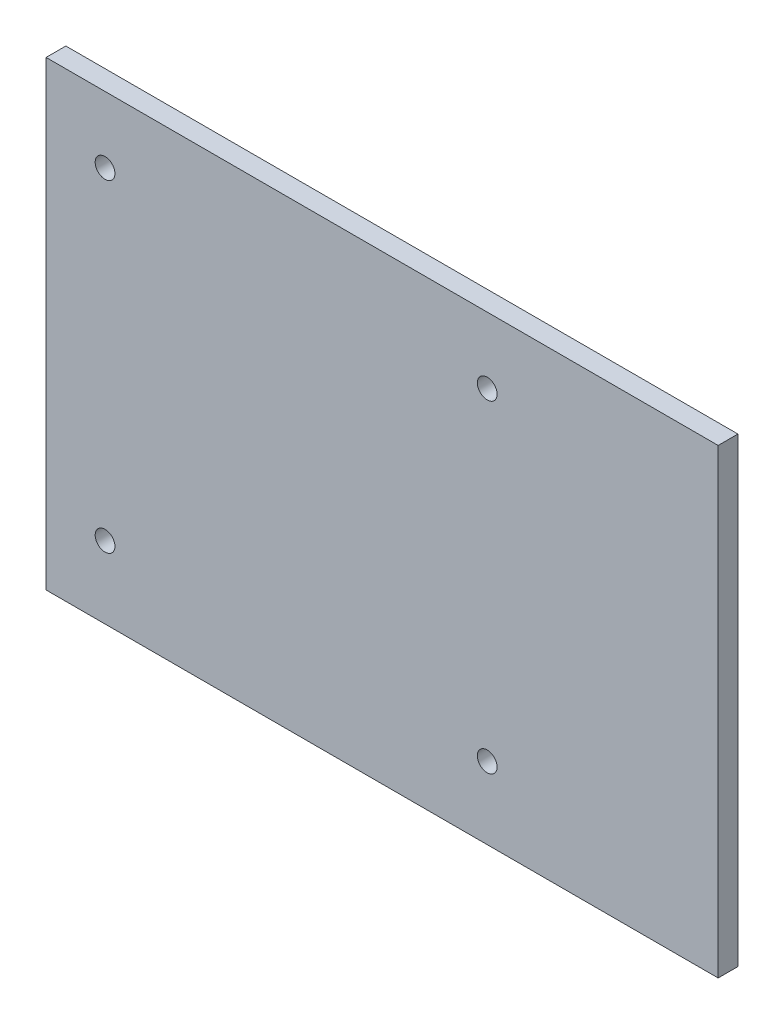
ISO-10303-21;
HEADER;
FILE_DESCRIPTION(('STEP AP214'),'2;1');
FILE_NAME('part.step','',(''),(''),'','','');
FILE_SCHEMA(('AUTOMOTIVE_DESIGN { 1 0 10303 214 1 1 1 1 }'));
ENDSEC;
DATA;
#1=APPLICATION_CONTEXT('core data for automotive mechanical design processes');
#2=APPLICATION_PROTOCOL_DEFINITION('international standard','automotive_design',2000,#1);
#3=PRODUCT_CONTEXT('',#1,'mechanical');
#4=PRODUCT('Part','Part','',(#3));
#5=PRODUCT_RELATED_PRODUCT_CATEGORY('part','',(#4));
#6=PRODUCT_DEFINITION_FORMATION('','',#4);
#7=PRODUCT_DEFINITION_CONTEXT('part definition',#1,'design');
#8=PRODUCT_DEFINITION('design','',#6,#7);
#9=PRODUCT_DEFINITION_SHAPE('','',#8);
#10=(LENGTH_UNIT() NAMED_UNIT(*) SI_UNIT(.MILLI.,.METRE.));
#11=(NAMED_UNIT(*) PLANE_ANGLE_UNIT() SI_UNIT($,.RADIAN.));
#12=(NAMED_UNIT(*) SI_UNIT($,.STERADIAN.) SOLID_ANGLE_UNIT());
#13=UNCERTAINTY_MEASURE_WITH_UNIT(LENGTH_MEASURE(1.E-05),#10,'distance_accuracy_value','');
#14=(GEOMETRIC_REPRESENTATION_CONTEXT(3) GLOBAL_UNCERTAINTY_ASSIGNED_CONTEXT((#13)) GLOBAL_UNIT_ASSIGNED_CONTEXT((#10,
#11,#12)) REPRESENTATION_CONTEXT('',''));
#15=CARTESIAN_POINT('',(0.,0.,0.));
#16=DIRECTION('',(0.,0.,1.));
#17=DIRECTION('',(1.,0.,0.));
#18=AXIS2_PLACEMENT_3D('',#15,#16,#17);
#19=CARTESIAN_POINT('',(0.,0.,3.));
#20=DIRECTION('',(0.,0.,1.));
#21=DIRECTION('',(1.,0.,0.));
#22=AXIS2_PLACEMENT_3D('',#19,#20,#21);
#23=PLANE('',#22);
#24=CARTESIAN_POINT('',(40.2909090909091,-39.7669421487603,3.));
#25=DIRECTION('',(0.,0.,1.));
#26=DIRECTION('',(-1.,0.,0.));
#27=AXIS2_PLACEMENT_3D('',#24,#25,#26);
#28=CIRCLE('',#27,1.5);
#29=CARTESIAN_POINT('',(38.7909090909091,-39.7669421487603,3.));
#30=VERTEX_POINT('',#29);
#31=EDGE_CURVE('E142',#30,#30,#28,.T.);
#32=ORIENTED_EDGE('',*,*,#31,.F.);
#33=EDGE_LOOP('',(#32));
#34=FACE_BOUND('',#33,.T.);
#35=CARTESIAN_POINT('',(-17.7090909090909,-39.7669421487603,3.));
#36=DIRECTION('',(0.,0.,1.));
#37=DIRECTION('',(1.,0.,0.));
#38=AXIS2_PLACEMENT_3D('',#35,#36,#37);
#39=CIRCLE('',#38,1.5);
#40=CARTESIAN_POINT('',(-16.2090909090909,-39.7669421487603,3.));
#41=VERTEX_POINT('',#40);
#42=EDGE_CURVE('E112',#41,#41,#39,.T.);
#43=ORIENTED_EDGE('',*,*,#42,.F.);
#44=EDGE_LOOP('',(#43));
#45=FACE_BOUND('',#44,.T.);
#46=DIRECTION('',(0.,-1.,0.));
#47=VECTOR('',#46,1.);
#48=CARTESIAN_POINT('',(-26.6590909090909,19.2830578512397,3.));
#49=LINE('',#48,#47);
#50=CARTESIAN_POINT('',(-26.6590909090909,19.2830578512397,3.));
#51=VERTEX_POINT('',#50);
#52=CARTESIAN_POINT('',(-26.6590909090909,-50.7169421487603,3.));
#53=VERTEX_POINT('',#52);
#54=EDGE_CURVE('E92',#51,#53,#49,.T.);
#55=ORIENTED_EDGE('',*,*,#54,.T.);
#56=DIRECTION('',(1.,0.,0.));
#57=VECTOR('',#56,1.);
#58=CARTESIAN_POINT('',(-26.6590909090909,-50.7169421487603,3.));
#59=LINE('',#58,#57);
#60=CARTESIAN_POINT('',(75.3409090909091,-50.7169421487603,3.));
#61=VERTEX_POINT('',#60);
#62=EDGE_CURVE('E87',#53,#61,#59,.T.);
#63=ORIENTED_EDGE('',*,*,#62,.T.);
#64=DIRECTION('',(0.,1.,0.));
#65=VECTOR('',#64,1.);
#66=CARTESIAN_POINT('',(75.3409090909091,19.2830578512397,3.));
#67=LINE('',#66,#65);
#68=CARTESIAN_POINT('',(75.3409090909091,19.2830578512397,3.));
#69=VERTEX_POINT('',#68);
#70=EDGE_CURVE('E90',#61,#69,#67,.T.);
#71=ORIENTED_EDGE('',*,*,#70,.T.);
#72=DIRECTION('',(-1.,0.,0.));
#73=VECTOR('',#72,1.);
#74=CARTESIAN_POINT('',(-26.6590909090909,19.2830578512397,3.));
#75=LINE('',#74,#73);
#76=EDGE_CURVE('E57',#69,#51,#75,.T.);
#77=ORIENTED_EDGE('',*,*,#76,.T.);
#78=EDGE_LOOP('',(#55,#63,#71,#77));
#79=FACE_BOUND('',#78,.T.);
#80=CARTESIAN_POINT('',(-17.7090909090909,9.23305785123966,3.));
#81=DIRECTION('',(0.,0.,1.));
#82=DIRECTION('',(-1.,0.,0.));
#83=AXIS2_PLACEMENT_3D('',#80,#81,#82);
#84=CIRCLE('',#83,1.5);
#85=CARTESIAN_POINT('',(-19.2090909090909,9.23305785123966,3.));
#86=VERTEX_POINT('',#85);
#87=EDGE_CURVE('E134',#86,#86,#84,.T.);
#88=ORIENTED_EDGE('',*,*,#87,.F.);
#89=EDGE_LOOP('',(#88));
#90=FACE_BOUND('',#89,.T.);
#91=CARTESIAN_POINT('',(40.2909090909091,9.23305785123966,3.));
#92=DIRECTION('',(0.,0.,1.));
#93=DIRECTION('',(1.,0.,0.));
#94=AXIS2_PLACEMENT_3D('',#91,#92,#93);
#95=CIRCLE('',#94,1.5);
#96=CARTESIAN_POINT('',(41.7909090909091,9.23305785123966,3.));
#97=VERTEX_POINT('',#96);
#98=EDGE_CURVE('E150',#97,#97,#95,.T.);
#99=ORIENTED_EDGE('',*,*,#98,.F.);
#100=EDGE_LOOP('',(#99));
#101=FACE_BOUND('',#100,.T.);
#102=ADVANCED_FACE('F39',(#34,#45,#79,#90,#101),#23,.T.);
#103=CARTESIAN_POINT('',(0.,0.,0.));
#104=DIRECTION('',(0.,0.,1.));
#105=DIRECTION('',(1.,0.,0.));
#106=AXIS2_PLACEMENT_3D('',#103,#104,#105);
#107=PLANE('',#106);
#108=DIRECTION('',(0.,-1.,0.));
#109=VECTOR('',#108,1.);
#110=CARTESIAN_POINT('',(-26.6590909090909,19.2830578512397,0.));
#111=LINE('',#110,#109);
#112=CARTESIAN_POINT('',(-26.6590909090909,19.2830578512397,0.));
#113=VERTEX_POINT('',#112);
#114=CARTESIAN_POINT('',(-26.6590909090909,-50.7169421487603,0.));
#115=VERTEX_POINT('',#114);
#116=EDGE_CURVE('E108',#113,#115,#111,.T.);
#117=ORIENTED_EDGE('',*,*,#116,.F.);
#118=DIRECTION('',(-1.,0.,0.));
#119=VECTOR('',#118,1.);
#120=CARTESIAN_POINT('',(-26.6590909090909,19.2830578512397,0.));
#121=LINE('',#120,#119);
#122=CARTESIAN_POINT('',(75.3409090909091,19.2830578512397,0.));
#123=VERTEX_POINT('',#122);
#124=EDGE_CURVE('E80',#123,#113,#121,.T.);
#125=ORIENTED_EDGE('',*,*,#124,.F.);
#126=DIRECTION('',(0.,1.,0.));
#127=VECTOR('',#126,1.);
#128=CARTESIAN_POINT('',(75.3409090909091,19.2830578512397,0.));
#129=LINE('',#128,#127);
#130=CARTESIAN_POINT('',(75.3409090909091,-50.7169421487603,0.));
#131=VERTEX_POINT('',#130);
#132=EDGE_CURVE('E74',#131,#123,#129,.T.);
#133=ORIENTED_EDGE('',*,*,#132,.F.);
#134=DIRECTION('',(1.,0.,0.));
#135=VECTOR('',#134,1.);
#136=CARTESIAN_POINT('',(-26.6590909090909,-50.7169421487603,0.));
#137=LINE('',#136,#135);
#138=EDGE_CURVE('E97',#115,#131,#137,.T.);
#139=ORIENTED_EDGE('',*,*,#138,.F.);
#140=EDGE_LOOP('',(#117,#125,#133,#139));
#141=FACE_BOUND('',#140,.T.);
#142=CARTESIAN_POINT('',(-17.7090909090909,-39.7669421487603,0.));
#143=DIRECTION('',(0.,0.,1.));
#144=DIRECTION('',(1.,0.,0.));
#145=AXIS2_PLACEMENT_3D('',#142,#143,#144);
#146=CIRCLE('',#145,1.5);
#147=CARTESIAN_POINT('',(-16.2090909090909,-39.7669421487603,0.));
#148=VERTEX_POINT('',#147);
#149=EDGE_CURVE('E130',#148,#148,#146,.T.);
#150=ORIENTED_EDGE('',*,*,#149,.T.);
#151=EDGE_LOOP('',(#150));
#152=FACE_BOUND('',#151,.T.);
#153=CARTESIAN_POINT('',(-17.7090909090909,9.23305785123966,0.));
#154=DIRECTION('',(0.,0.,1.));
#155=DIRECTION('',(-1.,0.,0.));
#156=AXIS2_PLACEMENT_3D('',#153,#154,#155);
#157=CIRCLE('',#156,1.5);
#158=CARTESIAN_POINT('',(-19.2090909090909,9.23305785123966,0.));
#159=VERTEX_POINT('',#158);
#160=EDGE_CURVE('E138',#159,#159,#157,.T.);
#161=ORIENTED_EDGE('',*,*,#160,.T.);
#162=EDGE_LOOP('',(#161));
#163=FACE_BOUND('',#162,.T.);
#164=CARTESIAN_POINT('',(40.2909090909091,-39.7669421487603,0.));
#165=DIRECTION('',(0.,0.,1.));
#166=DIRECTION('',(-1.,0.,0.));
#167=AXIS2_PLACEMENT_3D('',#164,#165,#166);
#168=CIRCLE('',#167,1.5);
#169=CARTESIAN_POINT('',(38.7909090909091,-39.7669421487603,0.));
#170=VERTEX_POINT('',#169);
#171=EDGE_CURVE('E146',#170,#170,#168,.T.);
#172=ORIENTED_EDGE('',*,*,#171,.T.);
#173=EDGE_LOOP('',(#172));
#174=FACE_BOUND('',#173,.T.);
#175=CARTESIAN_POINT('',(40.2909090909091,9.23305785123966,0.));
#176=DIRECTION('',(0.,0.,1.));
#177=DIRECTION('',(1.,0.,0.));
#178=AXIS2_PLACEMENT_3D('',#175,#176,#177);
#179=CIRCLE('',#178,1.5);
#180=CARTESIAN_POINT('',(41.7909090909091,9.23305785123966,0.));
#181=VERTEX_POINT('',#180);
#182=EDGE_CURVE('E154',#181,#181,#179,.T.);
#183=ORIENTED_EDGE('',*,*,#182,.T.);
#184=EDGE_LOOP('',(#183));
#185=FACE_BOUND('',#184,.T.);
#186=ADVANCED_FACE('F125',(#141,#152,#163,#174,#185),#107,.F.);
#187=CARTESIAN_POINT('',(-26.6590909090909,19.2830578512397,3.));
#188=DIRECTION('',(1.,0.,0.));
#189=DIRECTION('',(0.,1.,0.));
#190=AXIS2_PLACEMENT_3D('',#187,#188,#189);
#191=PLANE('',#190);
#192=ORIENTED_EDGE('',*,*,#116,.T.);
#193=DIRECTION('',(0.,0.,-1.));
#194=VECTOR('',#193,1.);
#195=CARTESIAN_POINT('',(-26.6590909090909,-50.7169421487603,3.));
#196=LINE('',#195,#194);
#197=EDGE_CURVE('E11',#53,#115,#196,.T.);
#198=ORIENTED_EDGE('',*,*,#197,.F.);
#199=ORIENTED_EDGE('',*,*,#54,.F.);
#200=DIRECTION('',(0.,0.,-1.));
#201=VECTOR('',#200,1.);
#202=CARTESIAN_POINT('',(-26.6590909090909,19.2830578512397,3.));
#203=LINE('',#202,#201);
#204=EDGE_CURVE('E104',#51,#113,#203,.T.);
#205=ORIENTED_EDGE('',*,*,#204,.T.);
#206=EDGE_LOOP('',(#192,#198,#199,#205));
#207=FACE_BOUND('',#206,.T.);
#208=ADVANCED_FACE('F41',(#207),#191,.F.);
#209=CARTESIAN_POINT('',(-26.6590909090909,-50.7169421487603,3.));
#210=DIRECTION('',(0.,1.,0.));
#211=DIRECTION('',(0.,0.,1.));
#212=AXIS2_PLACEMENT_3D('',#209,#210,#211);
#213=PLANE('',#212);
#214=ORIENTED_EDGE('',*,*,#138,.T.);
#215=DIRECTION('',(0.,0.,-1.));
#216=VECTOR('',#215,1.);
#217=CARTESIAN_POINT('',(75.3409090909091,-50.7169421487603,3.));
#218=LINE('',#217,#216);
#219=EDGE_CURVE('E49',#61,#131,#218,.T.);
#220=ORIENTED_EDGE('',*,*,#219,.F.);
#221=ORIENTED_EDGE('',*,*,#62,.F.);
#222=ORIENTED_EDGE('',*,*,#197,.T.);
#223=EDGE_LOOP('',(#214,#220,#221,#222));
#224=FACE_BOUND('',#223,.T.);
#225=ADVANCED_FACE('F96',(#224),#213,.F.);
#226=CARTESIAN_POINT('',(75.3409090909091,19.2830578512397,3.));
#227=DIRECTION('',(-1.,0.,0.));
#228=DIRECTION('',(0.,-1.,0.));
#229=AXIS2_PLACEMENT_3D('',#226,#227,#228);
#230=PLANE('',#229);
#231=ORIENTED_EDGE('',*,*,#132,.T.);
#232=DIRECTION('',(0.,0.,-1.));
#233=VECTOR('',#232,1.);
#234=CARTESIAN_POINT('',(75.3409090909091,19.2830578512397,3.));
#235=LINE('',#234,#233);
#236=EDGE_CURVE('E99',#69,#123,#235,.T.);
#237=ORIENTED_EDGE('',*,*,#236,.F.);
#238=ORIENTED_EDGE('',*,*,#70,.F.);
#239=ORIENTED_EDGE('',*,*,#219,.T.);
#240=EDGE_LOOP('',(#231,#237,#238,#239));
#241=FACE_BOUND('',#240,.T.);
#242=ADVANCED_FACE('F100',(#241),#230,.F.);
#243=CARTESIAN_POINT('',(-26.6590909090909,19.2830578512397,3.));
#244=DIRECTION('',(0.,-1.,0.));
#245=DIRECTION('',(0.,0.,-1.));
#246=AXIS2_PLACEMENT_3D('',#243,#244,#245);
#247=PLANE('',#246);
#248=ORIENTED_EDGE('',*,*,#124,.T.);
#249=ORIENTED_EDGE('',*,*,#204,.F.);
#250=ORIENTED_EDGE('',*,*,#76,.F.);
#251=ORIENTED_EDGE('',*,*,#236,.T.);
#252=EDGE_LOOP('',(#248,#249,#250,#251));
#253=FACE_BOUND('',#252,.T.);
#254=ADVANCED_FACE('F122',(#253),#247,.F.);
#255=CARTESIAN_POINT('',(-17.7090909090909,-39.7669421487603,3.));
#256=DIRECTION('',(0.,0.,-1.));
#257=DIRECTION('',(-1.,0.,0.));
#258=AXIS2_PLACEMENT_3D('',#255,#256,#257);
#259=CYLINDRICAL_SURFACE('',#258,1.5);
#260=ORIENTED_EDGE('',*,*,#42,.T.);
#261=EDGE_LOOP('',(#260));
#262=FACE_BOUND('',#261,.T.);
#263=ORIENTED_EDGE('',*,*,#149,.F.);
#264=EDGE_LOOP('',(#263));
#265=FACE_BOUND('',#264,.T.);
#266=ADVANCED_FACE('F175',(#262,#265),#259,.F.);
#267=CARTESIAN_POINT('',(-17.7090909090909,9.23305785123966,3.));
#268=DIRECTION('',(0.,0.,-1.));
#269=DIRECTION('',(-1.,0.,0.));
#270=AXIS2_PLACEMENT_3D('',#267,#268,#269);
#271=CYLINDRICAL_SURFACE('',#270,1.5);
#272=ORIENTED_EDGE('',*,*,#87,.T.);
#273=EDGE_LOOP('',(#272));
#274=FACE_BOUND('',#273,.T.);
#275=ORIENTED_EDGE('',*,*,#160,.F.);
#276=EDGE_LOOP('',(#275));
#277=FACE_BOUND('',#276,.T.);
#278=ADVANCED_FACE('F221',(#274,#277),#271,.F.);
#279=CARTESIAN_POINT('',(40.2909090909091,-39.7669421487603,3.));
#280=DIRECTION('',(0.,0.,-1.));
#281=DIRECTION('',(-1.,0.,0.));
#282=AXIS2_PLACEMENT_3D('',#279,#280,#281);
#283=CYLINDRICAL_SURFACE('',#282,1.5);
#284=ORIENTED_EDGE('',*,*,#31,.T.);
#285=EDGE_LOOP('',(#284));
#286=FACE_BOUND('',#285,.T.);
#287=ORIENTED_EDGE('',*,*,#171,.F.);
#288=EDGE_LOOP('',(#287));
#289=FACE_BOUND('',#288,.T.);
#290=ADVANCED_FACE('F229',(#286,#289),#283,.F.);
#291=CARTESIAN_POINT('',(40.2909090909091,9.23305785123966,3.));
#292=DIRECTION('',(0.,0.,-1.));
#293=DIRECTION('',(-1.,0.,0.));
#294=AXIS2_PLACEMENT_3D('',#291,#292,#293);
#295=CYLINDRICAL_SURFACE('',#294,1.5);
#296=ORIENTED_EDGE('',*,*,#98,.T.);
#297=EDGE_LOOP('',(#296));
#298=FACE_BOUND('',#297,.T.);
#299=ORIENTED_EDGE('',*,*,#182,.F.);
#300=EDGE_LOOP('',(#299));
#301=FACE_BOUND('',#300,.T.);
#302=ADVANCED_FACE('F162',(#298,#301),#295,.F.);
#303=CLOSED_SHELL('',(#102,#186,#208,#225,#242,#254,#266,#278,#290,#302));
#304=MANIFOLD_SOLID_BREP('B2',#303);
#305=ADVANCED_BREP_SHAPE_REPRESENTATION('',(#18,#304),#14);
#306=SHAPE_DEFINITION_REPRESENTATION(#9,#305);
ENDSEC;
END-ISO-10303-21;
